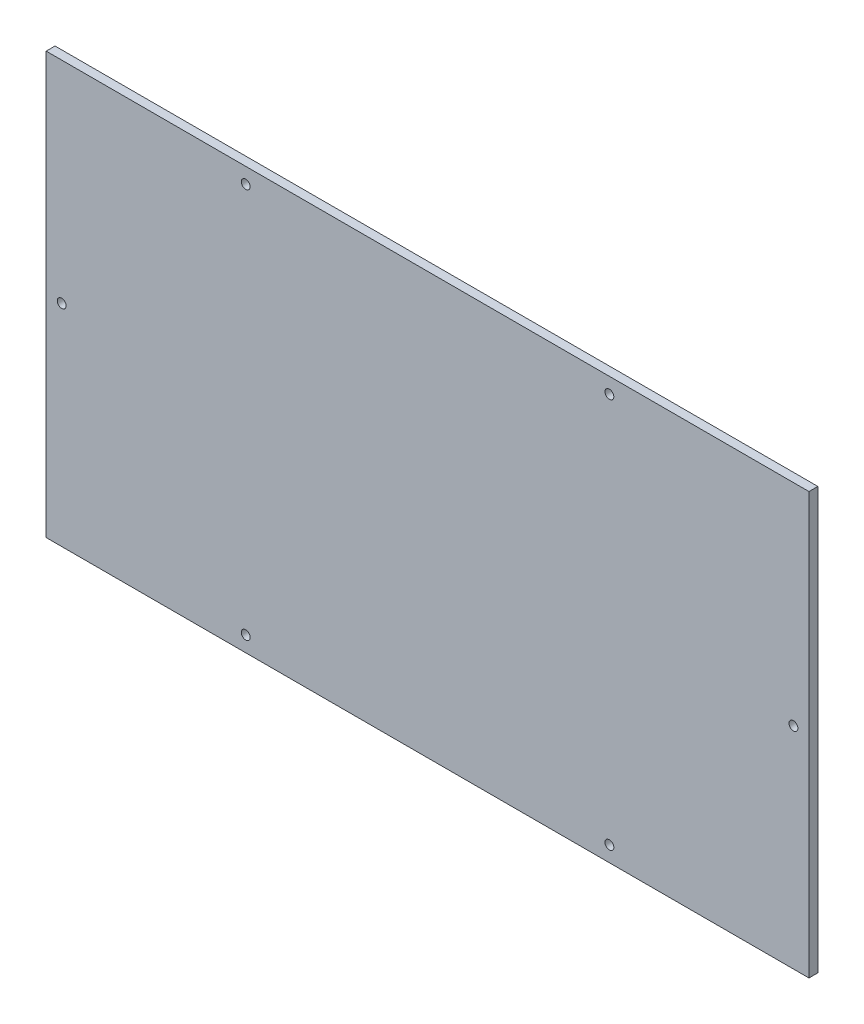
ISO-10303-21;
HEADER;
FILE_DESCRIPTION(('STEP AP214'),'2;1');
FILE_NAME('part.step','',(''),(''),'','','');
FILE_SCHEMA(('AUTOMOTIVE_DESIGN { 1 0 10303 214 1 1 1 1 }'));
ENDSEC;
DATA;
#1=APPLICATION_CONTEXT('core data for automotive mechanical design processes');
#2=APPLICATION_PROTOCOL_DEFINITION('international standard','automotive_design',2000,#1);
#3=PRODUCT_CONTEXT('',#1,'mechanical');
#4=PRODUCT('Part','Part','',(#3));
#5=PRODUCT_RELATED_PRODUCT_CATEGORY('part','',(#4));
#6=PRODUCT_DEFINITION_FORMATION('','',#4);
#7=PRODUCT_DEFINITION_CONTEXT('part definition',#1,'design');
#8=PRODUCT_DEFINITION('design','',#6,#7);
#9=PRODUCT_DEFINITION_SHAPE('','',#8);
#10=(LENGTH_UNIT() NAMED_UNIT(*) SI_UNIT(.MILLI.,.METRE.));
#11=(NAMED_UNIT(*) PLANE_ANGLE_UNIT() SI_UNIT($,.RADIAN.));
#12=(NAMED_UNIT(*) SI_UNIT($,.STERADIAN.) SOLID_ANGLE_UNIT());
#13=UNCERTAINTY_MEASURE_WITH_UNIT(LENGTH_MEASURE(1.E-05),#10,'distance_accuracy_value','');
#14=(GEOMETRIC_REPRESENTATION_CONTEXT(3) GLOBAL_UNCERTAINTY_ASSIGNED_CONTEXT((#13)) GLOBAL_UNIT_ASSIGNED_CONTEXT((#10,
#11,#12)) REPRESENTATION_CONTEXT('',''));
#15=CARTESIAN_POINT('',(0.,0.,0.));
#16=DIRECTION('',(0.,0.,1.));
#17=DIRECTION('',(1.,0.,0.));
#18=AXIS2_PLACEMENT_3D('',#15,#16,#17);
#19=CARTESIAN_POINT('',(0.,0.,4.));
#20=DIRECTION('',(0.,0.,1.));
#21=DIRECTION('',(1.,0.,0.));
#22=AXIS2_PLACEMENT_3D('',#19,#20,#21);
#23=PLANE('',#22);
#24=CARTESIAN_POINT('',(-254.,7.00000000000004,4.));
#25=DIRECTION('',(0.,0.,1.));
#26=DIRECTION('',(-1.,0.,0.));
#27=AXIS2_PLACEMENT_3D('',#24,#25,#26);
#28=CIRCLE('',#27,2.);
#29=CARTESIAN_POINT('',(-256.,7.00000000000004,4.));
#30=VERTEX_POINT('',#29);
#31=EDGE_CURVE('E135',#30,#30,#28,.T.);
#32=ORIENTED_EDGE('',*,*,#31,.F.);
#33=EDGE_LOOP('',(#32));
#34=FACE_BOUND('',#33,.T.);
#35=CARTESIAN_POINT('',(-7.,94.9999999999999,4.));
#36=DIRECTION('',(0.,0.,1.));
#37=DIRECTION('',(1.,0.,0.));
#38=AXIS2_PLACEMENT_3D('',#35,#36,#37);
#39=CIRCLE('',#38,2.);
#40=CARTESIAN_POINT('',(-5.,94.9999999999999,4.));
#41=VERTEX_POINT('',#40);
#42=EDGE_CURVE('E123',#41,#41,#39,.T.);
#43=ORIENTED_EDGE('',*,*,#42,.F.);
#44=EDGE_LOOP('',(#43));
#45=FACE_BOUND('',#44,.T.);
#46=CARTESIAN_POINT('',(-90.0000000000001,183.,4.));
#47=DIRECTION('',(0.,0.,1.));
#48=DIRECTION('',(-1.,0.,0.));
#49=AXIS2_PLACEMENT_3D('',#46,#47,#48);
#50=CIRCLE('',#49,2.);
#51=CARTESIAN_POINT('',(-92.0000000000001,183.,4.));
#52=VERTEX_POINT('',#51);
#53=EDGE_CURVE('E102',#52,#52,#50,.T.);
#54=ORIENTED_EDGE('',*,*,#53,.F.);
#55=EDGE_LOOP('',(#54));
#56=FACE_BOUND('',#55,.T.);
#57=DIRECTION('',(0.,1.,0.));
#58=VECTOR('',#57,1.);
#59=CARTESIAN_POINT('',(0.,0.,4.));
#60=LINE('',#59,#58);
#61=CARTESIAN_POINT('',(0.,0.,4.));
#62=VERTEX_POINT('',#61);
#63=CARTESIAN_POINT('',(0.,190.,4.));
#64=VERTEX_POINT('',#63);
#65=EDGE_CURVE('E87',#62,#64,#60,.T.);
#66=ORIENTED_EDGE('',*,*,#65,.T.);
#67=DIRECTION('',(-1.,0.,0.));
#68=VECTOR('',#67,1.);
#69=CARTESIAN_POINT('',(0.,190.,4.));
#70=LINE('',#69,#68);
#71=CARTESIAN_POINT('',(-344.,190.,4.));
#72=VERTEX_POINT('',#71);
#73=EDGE_CURVE('E82',#64,#72,#70,.T.);
#74=ORIENTED_EDGE('',*,*,#73,.T.);
#75=DIRECTION('',(0.,-1.,0.));
#76=VECTOR('',#75,1.);
#77=CARTESIAN_POINT('',(-344.,0.,4.));
#78=LINE('',#77,#76);
#79=CARTESIAN_POINT('',(-344.,0.,4.));
#80=VERTEX_POINT('',#79);
#81=EDGE_CURVE('E85',#72,#80,#78,.T.);
#82=ORIENTED_EDGE('',*,*,#81,.T.);
#83=DIRECTION('',(1.,0.,0.));
#84=VECTOR('',#83,1.);
#85=CARTESIAN_POINT('',(0.,0.,4.));
#86=LINE('',#85,#84);
#87=EDGE_CURVE('E52',#80,#62,#86,.T.);
#88=ORIENTED_EDGE('',*,*,#87,.T.);
#89=EDGE_LOOP('',(#66,#74,#82,#88));
#90=FACE_BOUND('',#89,.T.);
#91=CARTESIAN_POINT('',(-254.,183.,4.));
#92=DIRECTION('',(0.,0.,1.));
#93=DIRECTION('',(1.,0.,0.));
#94=AXIS2_PLACEMENT_3D('',#91,#92,#93);
#95=CIRCLE('',#94,2.);
#96=CARTESIAN_POINT('',(-252.,183.,4.));
#97=VERTEX_POINT('',#96);
#98=EDGE_CURVE('E117',#97,#97,#95,.T.);
#99=ORIENTED_EDGE('',*,*,#98,.F.);
#100=EDGE_LOOP('',(#99));
#101=FACE_BOUND('',#100,.T.);
#102=CARTESIAN_POINT('',(-337.,94.9999999999999,4.));
#103=DIRECTION('',(0.,0.,1.));
#104=DIRECTION('',(-1.,0.,0.));
#105=AXIS2_PLACEMENT_3D('',#102,#103,#104);
#106=CIRCLE('',#105,2.);
#107=CARTESIAN_POINT('',(-339.,94.9999999999999,4.));
#108=VERTEX_POINT('',#107);
#109=EDGE_CURVE('E129',#108,#108,#106,.T.);
#110=ORIENTED_EDGE('',*,*,#109,.F.);
#111=EDGE_LOOP('',(#110));
#112=FACE_BOUND('',#111,.T.);
#113=CARTESIAN_POINT('',(-90.0000000000001,7.00000000000006,4.));
#114=DIRECTION('',(0.,0.,1.));
#115=DIRECTION('',(1.,0.,0.));
#116=AXIS2_PLACEMENT_3D('',#113,#114,#115);
#117=CIRCLE('',#116,2.);
#118=CARTESIAN_POINT('',(-88.0000000000001,7.00000000000006,4.));
#119=VERTEX_POINT('',#118);
#120=EDGE_CURVE('E141',#119,#119,#117,.T.);
#121=ORIENTED_EDGE('',*,*,#120,.F.);
#122=EDGE_LOOP('',(#121));
#123=FACE_BOUND('',#122,.T.);
#124=ADVANCED_FACE('F35',(#34,#45,#56,#90,#101,#112,#123),#23,.T.);
#125=CARTESIAN_POINT('',(0.,0.,0.));
#126=DIRECTION('',(0.,0.,1.));
#127=DIRECTION('',(1.,0.,0.));
#128=AXIS2_PLACEMENT_3D('',#125,#126,#127);
#129=PLANE('',#128);
#130=CARTESIAN_POINT('',(-254.,7.00000000000004,0.));
#131=DIRECTION('',(0.,0.,1.));
#132=DIRECTION('',(-1.,0.,0.));
#133=AXIS2_PLACEMENT_3D('',#130,#131,#132);
#134=CIRCLE('',#133,2.);
#135=CARTESIAN_POINT('',(-256.,7.00000000000004,0.));
#136=VERTEX_POINT('',#135);
#137=EDGE_CURVE('E138',#136,#136,#134,.T.);
#138=ORIENTED_EDGE('',*,*,#137,.T.);
#139=EDGE_LOOP('',(#138));
#140=FACE_BOUND('',#139,.T.);
#141=CARTESIAN_POINT('',(-7.,94.9999999999999,0.));
#142=DIRECTION('',(0.,0.,1.));
#143=DIRECTION('',(1.,0.,0.));
#144=AXIS2_PLACEMENT_3D('',#141,#142,#143);
#145=CIRCLE('',#144,2.);
#146=CARTESIAN_POINT('',(-5.,94.9999999999999,0.));
#147=VERTEX_POINT('',#146);
#148=EDGE_CURVE('E126',#147,#147,#145,.T.);
#149=ORIENTED_EDGE('',*,*,#148,.T.);
#150=EDGE_LOOP('',(#149));
#151=FACE_BOUND('',#150,.T.);
#152=CARTESIAN_POINT('',(-90.0000000000001,183.,0.));
#153=DIRECTION('',(0.,0.,1.));
#154=DIRECTION('',(-1.,0.,0.));
#155=AXIS2_PLACEMENT_3D('',#152,#153,#154);
#156=CIRCLE('',#155,2.);
#157=CARTESIAN_POINT('',(-92.0000000000001,183.,0.));
#158=VERTEX_POINT('',#157);
#159=EDGE_CURVE('E114',#158,#158,#156,.T.);
#160=ORIENTED_EDGE('',*,*,#159,.T.);
#161=EDGE_LOOP('',(#160));
#162=FACE_BOUND('',#161,.T.);
#163=DIRECTION('',(0.,1.,0.));
#164=VECTOR('',#163,1.);
#165=CARTESIAN_POINT('',(0.,0.,0.));
#166=LINE('',#165,#164);
#167=CARTESIAN_POINT('',(0.,0.,0.));
#168=VERTEX_POINT('',#167);
#169=CARTESIAN_POINT('',(0.,190.,0.));
#170=VERTEX_POINT('',#169);
#171=EDGE_CURVE('E99',#168,#170,#166,.T.);
#172=ORIENTED_EDGE('',*,*,#171,.F.);
#173=DIRECTION('',(1.,0.,0.));
#174=VECTOR('',#173,1.);
#175=CARTESIAN_POINT('',(0.,0.,0.));
#176=LINE('',#175,#174);
#177=CARTESIAN_POINT('',(-344.,0.,0.));
#178=VERTEX_POINT('',#177);
#179=EDGE_CURVE('E75',#178,#168,#176,.T.);
#180=ORIENTED_EDGE('',*,*,#179,.F.);
#181=DIRECTION('',(0.,-1.,0.));
#182=VECTOR('',#181,1.);
#183=CARTESIAN_POINT('',(-344.,0.,0.));
#184=LINE('',#183,#182);
#185=CARTESIAN_POINT('',(-344.,190.,0.));
#186=VERTEX_POINT('',#185);
#187=EDGE_CURVE('E69',#186,#178,#184,.T.);
#188=ORIENTED_EDGE('',*,*,#187,.F.);
#189=DIRECTION('',(-1.,0.,0.));
#190=VECTOR('',#189,1.);
#191=CARTESIAN_POINT('',(0.,190.,0.));
#192=LINE('',#191,#190);
#193=EDGE_CURVE('E91',#170,#186,#192,.T.);
#194=ORIENTED_EDGE('',*,*,#193,.F.);
#195=EDGE_LOOP('',(#172,#180,#188,#194));
#196=FACE_BOUND('',#195,.T.);
#197=CARTESIAN_POINT('',(-254.,183.,0.));
#198=DIRECTION('',(0.,0.,1.));
#199=DIRECTION('',(1.,0.,0.));
#200=AXIS2_PLACEMENT_3D('',#197,#198,#199);
#201=CIRCLE('',#200,2.);
#202=CARTESIAN_POINT('',(-252.,183.,0.));
#203=VERTEX_POINT('',#202);
#204=EDGE_CURVE('E120',#203,#203,#201,.T.);
#205=ORIENTED_EDGE('',*,*,#204,.T.);
#206=EDGE_LOOP('',(#205));
#207=FACE_BOUND('',#206,.T.);
#208=CARTESIAN_POINT('',(-337.,94.9999999999999,0.));
#209=DIRECTION('',(0.,0.,1.));
#210=DIRECTION('',(-1.,0.,0.));
#211=AXIS2_PLACEMENT_3D('',#208,#209,#210);
#212=CIRCLE('',#211,2.);
#213=CARTESIAN_POINT('',(-339.,94.9999999999999,0.));
#214=VERTEX_POINT('',#213);
#215=EDGE_CURVE('E132',#214,#214,#212,.T.);
#216=ORIENTED_EDGE('',*,*,#215,.T.);
#217=EDGE_LOOP('',(#216));
#218=FACE_BOUND('',#217,.T.);
#219=CARTESIAN_POINT('',(-90.0000000000001,7.00000000000006,0.));
#220=DIRECTION('',(0.,0.,1.));
#221=DIRECTION('',(1.,0.,0.));
#222=AXIS2_PLACEMENT_3D('',#219,#220,#221);
#223=CIRCLE('',#222,2.);
#224=CARTESIAN_POINT('',(-88.0000000000001,7.00000000000006,0.));
#225=VERTEX_POINT('',#224);
#226=EDGE_CURVE('E144',#225,#225,#223,.T.);
#227=ORIENTED_EDGE('',*,*,#226,.T.);
#228=EDGE_LOOP('',(#227));
#229=FACE_BOUND('',#228,.T.);
#230=ADVANCED_FACE('F110',(#140,#151,#162,#196,#207,#218,#229),#129,.F.);
#231=CARTESIAN_POINT('',(0.,0.,4.));
#232=DIRECTION('',(-1.,0.,0.));
#233=DIRECTION('',(0.,0.,1.));
#234=AXIS2_PLACEMENT_3D('',#231,#232,#233);
#235=PLANE('',#234);
#236=ORIENTED_EDGE('',*,*,#171,.T.);
#237=DIRECTION('',(0.,0.,-1.));
#238=VECTOR('',#237,1.);
#239=CARTESIAN_POINT('',(0.,190.,4.));
#240=LINE('',#239,#238);
#241=EDGE_CURVE('E11',#64,#170,#240,.T.);
#242=ORIENTED_EDGE('',*,*,#241,.F.);
#243=ORIENTED_EDGE('',*,*,#65,.F.);
#244=DIRECTION('',(0.,0.,-1.));
#245=VECTOR('',#244,1.);
#246=CARTESIAN_POINT('',(0.,0.,4.));
#247=LINE('',#246,#245);
#248=EDGE_CURVE('E95',#62,#168,#247,.T.);
#249=ORIENTED_EDGE('',*,*,#248,.T.);
#250=EDGE_LOOP('',(#236,#242,#243,#249));
#251=FACE_BOUND('',#250,.T.);
#252=ADVANCED_FACE('F37',(#251),#235,.F.);
#253=CARTESIAN_POINT('',(0.,190.,4.));
#254=DIRECTION('',(0.,-1.,0.));
#255=DIRECTION('',(1.,0.,0.));
#256=AXIS2_PLACEMENT_3D('',#253,#254,#255);
#257=PLANE('',#256);
#258=ORIENTED_EDGE('',*,*,#193,.T.);
#259=DIRECTION('',(0.,0.,-1.));
#260=VECTOR('',#259,1.);
#261=CARTESIAN_POINT('',(-344.,190.,4.));
#262=LINE('',#261,#260);
#263=EDGE_CURVE('E44',#72,#186,#262,.T.);
#264=ORIENTED_EDGE('',*,*,#263,.F.);
#265=ORIENTED_EDGE('',*,*,#73,.F.);
#266=ORIENTED_EDGE('',*,*,#241,.T.);
#267=EDGE_LOOP('',(#258,#264,#265,#266));
#268=FACE_BOUND('',#267,.T.);
#269=ADVANCED_FACE('F90',(#268),#257,.F.);
#270=CARTESIAN_POINT('',(-344.,0.,4.));
#271=DIRECTION('',(1.,0.,0.));
#272=DIRECTION('',(0.,0.,-1.));
#273=AXIS2_PLACEMENT_3D('',#270,#271,#272);
#274=PLANE('',#273);
#275=ORIENTED_EDGE('',*,*,#187,.T.);
#276=DIRECTION('',(0.,0.,-1.));
#277=VECTOR('',#276,1.);
#278=CARTESIAN_POINT('',(-344.,0.,4.));
#279=LINE('',#278,#277);
#280=EDGE_CURVE('E92',#80,#178,#279,.T.);
#281=ORIENTED_EDGE('',*,*,#280,.F.);
#282=ORIENTED_EDGE('',*,*,#81,.F.);
#283=ORIENTED_EDGE('',*,*,#263,.T.);
#284=EDGE_LOOP('',(#275,#281,#282,#283));
#285=FACE_BOUND('',#284,.T.);
#286=ADVANCED_FACE('F93',(#285),#274,.F.);
#287=CARTESIAN_POINT('',(0.,0.,4.));
#288=DIRECTION('',(0.,1.,0.));
#289=DIRECTION('',(-1.,0.,0.));
#290=AXIS2_PLACEMENT_3D('',#287,#288,#289);
#291=PLANE('',#290);
#292=ORIENTED_EDGE('',*,*,#179,.T.);
#293=ORIENTED_EDGE('',*,*,#248,.F.);
#294=ORIENTED_EDGE('',*,*,#87,.F.);
#295=ORIENTED_EDGE('',*,*,#280,.T.);
#296=EDGE_LOOP('',(#292,#293,#294,#295));
#297=FACE_BOUND('',#296,.T.);
#298=ADVANCED_FACE('F107',(#297),#291,.F.);
#299=CARTESIAN_POINT('',(-90.0000000000001,183.,4.));
#300=DIRECTION('',(0.,0.,-1.));
#301=DIRECTION('',(-1.,0.,0.));
#302=AXIS2_PLACEMENT_3D('',#299,#300,#301);
#303=CYLINDRICAL_SURFACE('',#302,2.);
#304=ORIENTED_EDGE('',*,*,#53,.T.);
#305=EDGE_LOOP('',(#304));
#306=FACE_BOUND('',#305,.T.);
#307=ORIENTED_EDGE('',*,*,#159,.F.);
#308=EDGE_LOOP('',(#307));
#309=FACE_BOUND('',#308,.T.);
#310=ADVANCED_FACE('F164',(#306,#309),#303,.F.);
#311=CARTESIAN_POINT('',(-254.,183.,4.));
#312=DIRECTION('',(0.,0.,-1.));
#313=DIRECTION('',(-1.,0.,0.));
#314=AXIS2_PLACEMENT_3D('',#311,#312,#313);
#315=CYLINDRICAL_SURFACE('',#314,2.);
#316=ORIENTED_EDGE('',*,*,#98,.T.);
#317=EDGE_LOOP('',(#316));
#318=FACE_BOUND('',#317,.T.);
#319=ORIENTED_EDGE('',*,*,#204,.F.);
#320=EDGE_LOOP('',(#319));
#321=FACE_BOUND('',#320,.T.);
#322=ADVANCED_FACE('F212',(#318,#321),#315,.F.);
#323=CARTESIAN_POINT('',(-7.,94.9999999999999,4.));
#324=DIRECTION('',(0.,0.,-1.));
#325=DIRECTION('',(-1.,0.,0.));
#326=AXIS2_PLACEMENT_3D('',#323,#324,#325);
#327=CYLINDRICAL_SURFACE('',#326,2.);
#328=ORIENTED_EDGE('',*,*,#42,.T.);
#329=EDGE_LOOP('',(#328));
#330=FACE_BOUND('',#329,.T.);
#331=ORIENTED_EDGE('',*,*,#148,.F.);
#332=EDGE_LOOP('',(#331));
#333=FACE_BOUND('',#332,.T.);
#334=ADVANCED_FACE('F220',(#330,#333),#327,.F.);
#335=CARTESIAN_POINT('',(-337.,94.9999999999999,4.));
#336=DIRECTION('',(0.,0.,-1.));
#337=DIRECTION('',(-1.,0.,0.));
#338=AXIS2_PLACEMENT_3D('',#335,#336,#337);
#339=CYLINDRICAL_SURFACE('',#338,2.);
#340=ORIENTED_EDGE('',*,*,#109,.T.);
#341=EDGE_LOOP('',(#340));
#342=FACE_BOUND('',#341,.T.);
#343=ORIENTED_EDGE('',*,*,#215,.F.);
#344=EDGE_LOOP('',(#343));
#345=FACE_BOUND('',#344,.T.);
#346=ADVANCED_FACE('F228',(#342,#345),#339,.F.);
#347=CARTESIAN_POINT('',(-254.,7.00000000000004,4.));
#348=DIRECTION('',(0.,0.,-1.));
#349=DIRECTION('',(-1.,0.,0.));
#350=AXIS2_PLACEMENT_3D('',#347,#348,#349);
#351=CYLINDRICAL_SURFACE('',#350,2.);
#352=ORIENTED_EDGE('',*,*,#31,.T.);
#353=EDGE_LOOP('',(#352));
#354=FACE_BOUND('',#353,.T.);
#355=ORIENTED_EDGE('',*,*,#137,.F.);
#356=EDGE_LOOP('',(#355));
#357=FACE_BOUND('',#356,.T.);
#358=ADVANCED_FACE('F237',(#354,#357),#351,.F.);
#359=CARTESIAN_POINT('',(-90.0000000000001,7.00000000000006,4.));
#360=DIRECTION('',(0.,0.,-1.));
#361=DIRECTION('',(-1.,0.,0.));
#362=AXIS2_PLACEMENT_3D('',#359,#360,#361);
#363=CYLINDRICAL_SURFACE('',#362,2.);
#364=ORIENTED_EDGE('',*,*,#120,.T.);
#365=EDGE_LOOP('',(#364));
#366=FACE_BOUND('',#365,.T.);
#367=ORIENTED_EDGE('',*,*,#226,.F.);
#368=EDGE_LOOP('',(#367));
#369=FACE_BOUND('',#368,.T.);
#370=ADVANCED_FACE('F150',(#366,#369),#363,.F.);
#371=CLOSED_SHELL('',(#124,#230,#252,#269,#286,#298,#310,#322,#334,#346,#358,#370));
#372=MANIFOLD_SOLID_BREP('B2',#371);
#373=ADVANCED_BREP_SHAPE_REPRESENTATION('',(#18,#372),#14);
#374=SHAPE_DEFINITION_REPRESENTATION(#9,#373);
ENDSEC;
END-ISO-10303-21;
